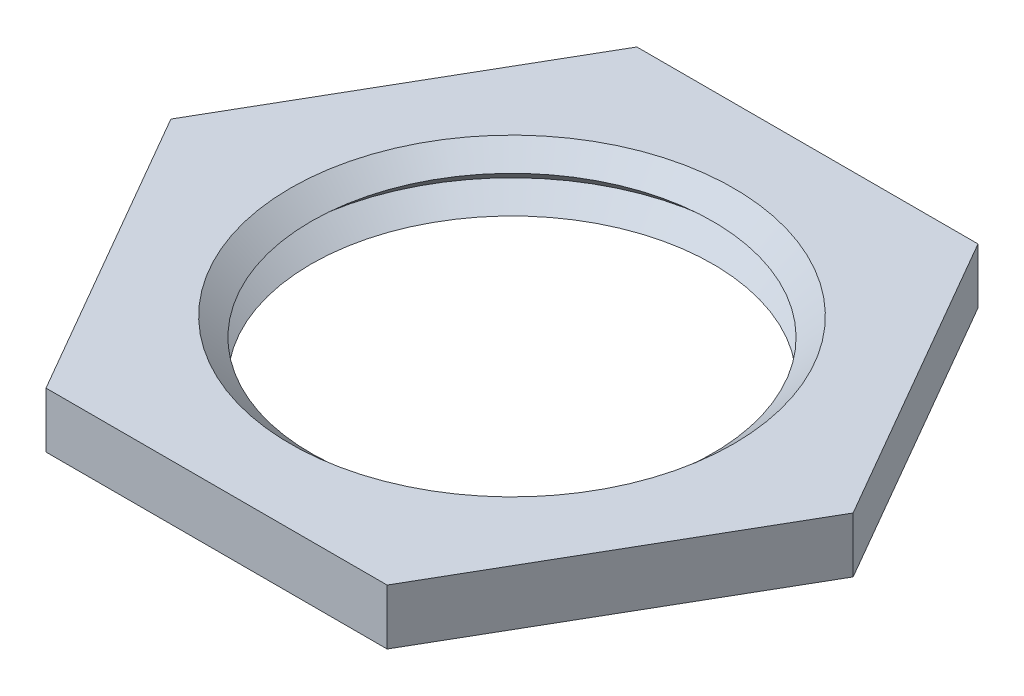
ISO-10303-21;
HEADER;
FILE_DESCRIPTION(('STEP AP214'),'2;1');
FILE_NAME('part.step','',(''),(''),'','','');
FILE_SCHEMA(('AUTOMOTIVE_DESIGN { 1 0 10303 214 1 1 1 1 }'));
ENDSEC;
DATA;
#1=APPLICATION_CONTEXT('core data for automotive mechanical design processes');
#2=APPLICATION_PROTOCOL_DEFINITION('international standard','automotive_design',2000,#1);
#3=PRODUCT_CONTEXT('',#1,'mechanical');
#4=PRODUCT('Part','Part','',(#3));
#5=PRODUCT_RELATED_PRODUCT_CATEGORY('part','',(#4));
#6=PRODUCT_DEFINITION_FORMATION('','',#4);
#7=PRODUCT_DEFINITION_CONTEXT('part definition',#1,'design');
#8=PRODUCT_DEFINITION('design','',#6,#7);
#9=PRODUCT_DEFINITION_SHAPE('','',#8);
#10=(LENGTH_UNIT() NAMED_UNIT(*) SI_UNIT(.MILLI.,.METRE.));
#11=(NAMED_UNIT(*) PLANE_ANGLE_UNIT() SI_UNIT($,.RADIAN.));
#12=(NAMED_UNIT(*) SI_UNIT($,.STERADIAN.) SOLID_ANGLE_UNIT());
#13=UNCERTAINTY_MEASURE_WITH_UNIT(LENGTH_MEASURE(1.E-05),#10,'distance_accuracy_value','');
#14=(GEOMETRIC_REPRESENTATION_CONTEXT(3) GLOBAL_UNCERTAINTY_ASSIGNED_CONTEXT((#13)) GLOBAL_UNIT_ASSIGNED_CONTEXT((#10,
#11,#12)) REPRESENTATION_CONTEXT('',''));
#15=CARTESIAN_POINT('',(0.,0.,0.));
#16=DIRECTION('',(0.,0.,1.));
#17=DIRECTION('',(1.,0.,0.));
#18=AXIS2_PLACEMENT_3D('',#15,#16,#17);
#19=CARTESIAN_POINT('',(0.,1.191006,0.));
#20=DIRECTION('',(0.,1.,0.));
#21=DIRECTION('',(0.,0.,1.));
#22=AXIS2_PLACEMENT_3D('',#19,#20,#21);
#23=PLANE('',#22);
#24=DIRECTION('',(0.5,0.,-0.866025403784439));
#25=VECTOR('',#24,1.);
#26=CARTESIAN_POINT('',(3.66617420935413,1.191006,6.35));
#27=LINE('',#26,#25);
#28=CARTESIAN_POINT('',(3.66617420935413,1.191006,6.35));
#29=VERTEX_POINT('',#28);
#30=CARTESIAN_POINT('',(7.33234841870824,1.191006,0.));
#31=VERTEX_POINT('',#30);
#32=EDGE_CURVE('E130',#29,#31,#27,.T.);
#33=ORIENTED_EDGE('',*,*,#32,.T.);
#34=DIRECTION('',(-0.500000000000001,0.,-0.866025403784438));
#35=VECTOR('',#34,1.);
#36=CARTESIAN_POINT('',(7.33234841870824,1.191006,0.));
#37=LINE('',#36,#35);
#38=CARTESIAN_POINT('',(3.66617420935411,1.191006,-6.35));
#39=VERTEX_POINT('',#38);
#40=EDGE_CURVE('E88',#31,#39,#37,.T.);
#41=ORIENTED_EDGE('',*,*,#40,.T.);
#42=DIRECTION('',(-1.,0.,0.));
#43=VECTOR('',#42,1.);
#44=CARTESIAN_POINT('',(3.66617420935411,1.191006,-6.35));
#45=LINE('',#44,#43);
#46=CARTESIAN_POINT('',(-3.66617420935412,1.191006,-6.35));
#47=VERTEX_POINT('',#46);
#48=EDGE_CURVE('E101',#39,#47,#45,.T.);
#49=ORIENTED_EDGE('',*,*,#48,.T.);
#50=DIRECTION('',(-0.5,0.,0.866025403784439));
#51=VECTOR('',#50,1.);
#52=CARTESIAN_POINT('',(-3.66617420935412,1.191006,-6.35));
#53=LINE('',#52,#51);
#54=CARTESIAN_POINT('',(-7.33234841870824,1.191006,0.));
#55=VERTEX_POINT('',#54);
#56=EDGE_CURVE('E95',#47,#55,#53,.T.);
#57=ORIENTED_EDGE('',*,*,#56,.T.);
#58=DIRECTION('',(0.5,0.,0.866025403784438));
#59=VECTOR('',#58,1.);
#60=CARTESIAN_POINT('',(-7.33234841870824,1.191006,0.));
#61=LINE('',#60,#59);
#62=CARTESIAN_POINT('',(-3.66617420935412,1.191006,6.35));
#63=VERTEX_POINT('',#62);
#64=EDGE_CURVE('E99',#55,#63,#61,.T.);
#65=ORIENTED_EDGE('',*,*,#64,.T.);
#66=DIRECTION('',(1.,0.,0.));
#67=VECTOR('',#66,1.);
#68=CARTESIAN_POINT('',(-3.66617420935412,1.191006,6.35));
#69=LINE('',#68,#67);
#70=EDGE_CURVE('E51',#63,#29,#69,.T.);
#71=ORIENTED_EDGE('',*,*,#70,.T.);
#72=EDGE_LOOP('',(#33,#41,#49,#57,#65,#71));
#73=FACE_BOUND('',#72,.T.);
#74=CARTESIAN_POINT('',(0.,1.19100600000003,0.));
#75=DIRECTION('',(0.,1.,0.));
#76=DIRECTION('',(-1.,0.,0.));
#77=AXIS2_PLACEMENT_3D('',#74,#75,#76);
#78=CIRCLE('',#77,4.76249999999999);
#79=CARTESIAN_POINT('',(-4.76249999999998,1.19100600000006,0.));
#80=VERTEX_POINT('',#79);
#81=EDGE_CURVE('E174',#80,#80,#78,.T.);
#82=ORIENTED_EDGE('',*,*,#81,.F.);
#83=EDGE_LOOP('',(#82));
#84=FACE_BOUND('',#83,.T.);
#85=ADVANCED_FACE('F34',(#73,#84),#23,.T.);
#86=CARTESIAN_POINT('',(0.,0.,0.));
#87=DIRECTION('',(0.,1.,0.));
#88=DIRECTION('',(0.,0.,1.));
#89=AXIS2_PLACEMENT_3D('',#86,#87,#88);
#90=PLANE('',#89);
#91=DIRECTION('',(0.5,0.,-0.866025403784439));
#92=VECTOR('',#91,1.);
#93=CARTESIAN_POINT('',(3.66617420935413,0.,6.35));
#94=LINE('',#93,#92);
#95=CARTESIAN_POINT('',(3.66617420935413,0.,6.35));
#96=VERTEX_POINT('',#95);
#97=CARTESIAN_POINT('',(7.33234841870824,0.,0.));
#98=VERTEX_POINT('',#97);
#99=EDGE_CURVE('E119',#96,#98,#94,.T.);
#100=ORIENTED_EDGE('',*,*,#99,.F.);
#101=DIRECTION('',(1.,0.,0.));
#102=VECTOR('',#101,1.);
#103=CARTESIAN_POINT('',(-3.66617420935412,0.,6.35));
#104=LINE('',#103,#102);
#105=CARTESIAN_POINT('',(-3.66617420935412,0.,6.35));
#106=VERTEX_POINT('',#105);
#107=EDGE_CURVE('E80',#106,#96,#104,.T.);
#108=ORIENTED_EDGE('',*,*,#107,.F.);
#109=DIRECTION('',(0.5,0.,0.866025403784438));
#110=VECTOR('',#109,1.);
#111=CARTESIAN_POINT('',(-7.33234841870824,0.,0.));
#112=LINE('',#111,#110);
#113=CARTESIAN_POINT('',(-7.33234841870824,0.,0.));
#114=VERTEX_POINT('',#113);
#115=EDGE_CURVE('E74',#114,#106,#112,.T.);
#116=ORIENTED_EDGE('',*,*,#115,.F.);
#117=DIRECTION('',(-0.5,0.,0.866025403784439));
#118=VECTOR('',#117,1.);
#119=CARTESIAN_POINT('',(-3.66617420935412,0.,-6.35));
#120=LINE('',#119,#118);
#121=CARTESIAN_POINT('',(-3.66617420935412,0.,-6.35));
#122=VERTEX_POINT('',#121);
#123=EDGE_CURVE('E109',#122,#114,#120,.T.);
#124=ORIENTED_EDGE('',*,*,#123,.F.);
#125=DIRECTION('',(-1.,0.,0.));
#126=VECTOR('',#125,1.);
#127=CARTESIAN_POINT('',(3.66617420935411,0.,-6.35));
#128=LINE('',#127,#126);
#129=CARTESIAN_POINT('',(3.66617420935411,0.,-6.35));
#130=VERTEX_POINT('',#129);
#131=EDGE_CURVE('E125',#130,#122,#128,.T.);
#132=ORIENTED_EDGE('',*,*,#131,.F.);
#133=DIRECTION('',(-0.500000000000001,0.,-0.866025403784438));
#134=VECTOR('',#133,1.);
#135=CARTESIAN_POINT('',(7.33234841870824,0.,0.));
#136=LINE('',#135,#134);
#137=EDGE_CURVE('E122',#98,#130,#136,.T.);
#138=ORIENTED_EDGE('',*,*,#137,.F.);
#139=EDGE_LOOP('',(#100,#108,#116,#124,#132,#138));
#140=FACE_BOUND('',#139,.T.);
#141=CARTESIAN_POINT('',(0.,0.,0.));
#142=DIRECTION('',(0.,1.,0.));
#143=DIRECTION('',(-1.,0.,0.));
#144=AXIS2_PLACEMENT_3D('',#141,#142,#143);
#145=CIRCLE('',#144,4.318);
#146=CARTESIAN_POINT('',(-4.318,0.,0.));
#147=VERTEX_POINT('',#146);
#148=EDGE_CURVE('E123',#147,#147,#145,.T.);
#149=ORIENTED_EDGE('',*,*,#148,.T.);
#150=EDGE_LOOP('',(#149));
#151=FACE_BOUND('',#150,.T.);
#152=ADVANCED_FACE('F139',(#140,#151),#90,.F.);
#153=CARTESIAN_POINT('',(3.66617420935413,1.191006,6.35));
#154=DIRECTION('',(-0.866025403784439,0.,-0.5));
#155=DIRECTION('',(-0.5,0.,0.866025403784439));
#156=AXIS2_PLACEMENT_3D('',#153,#154,#155);
#157=PLANE('',#156);
#158=ORIENTED_EDGE('',*,*,#99,.T.);
#159=DIRECTION('',(0.,-1.,0.));
#160=VECTOR('',#159,1.);
#161=CARTESIAN_POINT('',(7.33234841870824,1.191006,0.));
#162=LINE('',#161,#160);
#163=EDGE_CURVE('E11',#31,#98,#162,.T.);
#164=ORIENTED_EDGE('',*,*,#163,.F.);
#165=ORIENTED_EDGE('',*,*,#32,.F.);
#166=DIRECTION('',(0.,-1.,0.));
#167=VECTOR('',#166,1.);
#168=CARTESIAN_POINT('',(3.66617420935413,1.191006,6.35));
#169=LINE('',#168,#167);
#170=EDGE_CURVE('E115',#29,#96,#169,.T.);
#171=ORIENTED_EDGE('',*,*,#170,.T.);
#172=EDGE_LOOP('',(#158,#164,#165,#171));
#173=FACE_BOUND('',#172,.T.);
#174=ADVANCED_FACE('F36',(#173),#157,.F.);
#175=CARTESIAN_POINT('',(7.33234841870824,1.191006,0.));
#176=DIRECTION('',(-0.866025403784438,0.,0.500000000000001));
#177=DIRECTION('',(0.500000000000001,0.,0.866025403784438));
#178=AXIS2_PLACEMENT_3D('',#175,#176,#177);
#179=PLANE('',#178);
#180=ORIENTED_EDGE('',*,*,#137,.T.);
#181=DIRECTION('',(0.,-1.,0.));
#182=VECTOR('',#181,1.);
#183=CARTESIAN_POINT('',(3.66617420935411,1.191006,-6.35));
#184=LINE('',#183,#182);
#185=EDGE_CURVE('E43',#39,#130,#184,.T.);
#186=ORIENTED_EDGE('',*,*,#185,.F.);
#187=ORIENTED_EDGE('',*,*,#40,.F.);
#188=ORIENTED_EDGE('',*,*,#163,.T.);
#189=EDGE_LOOP('',(#180,#186,#187,#188));
#190=FACE_BOUND('',#189,.T.);
#191=ADVANCED_FACE('F230',(#190),#179,.F.);
#192=CARTESIAN_POINT('',(3.66617420935411,1.191006,-6.35));
#193=DIRECTION('',(0.,0.,1.));
#194=DIRECTION('',(1.,0.,0.));
#195=AXIS2_PLACEMENT_3D('',#192,#193,#194);
#196=PLANE('',#195);
#197=ORIENTED_EDGE('',*,*,#131,.T.);
#198=DIRECTION('',(0.,-1.,0.));
#199=VECTOR('',#198,1.);
#200=CARTESIAN_POINT('',(-3.66617420935412,1.191006,-6.35));
#201=LINE('',#200,#199);
#202=EDGE_CURVE('E110',#47,#122,#201,.T.);
#203=ORIENTED_EDGE('',*,*,#202,.F.);
#204=ORIENTED_EDGE('',*,*,#48,.F.);
#205=ORIENTED_EDGE('',*,*,#185,.T.);
#206=EDGE_LOOP('',(#197,#203,#204,#205));
#207=FACE_BOUND('',#206,.T.);
#208=ADVANCED_FACE('F136',(#207),#196,.F.);
#209=CARTESIAN_POINT('',(-3.66617420935412,1.191006,-6.35));
#210=DIRECTION('',(0.866025403784439,0.,0.5));
#211=DIRECTION('',(0.5,0.,-0.866025403784439));
#212=AXIS2_PLACEMENT_3D('',#209,#210,#211);
#213=PLANE('',#212);
#214=ORIENTED_EDGE('',*,*,#123,.T.);
#215=DIRECTION('',(0.,-1.,0.));
#216=VECTOR('',#215,1.);
#217=CARTESIAN_POINT('',(-7.33234841870824,1.191006,0.));
#218=LINE('',#217,#216);
#219=EDGE_CURVE('E106',#55,#114,#218,.T.);
#220=ORIENTED_EDGE('',*,*,#219,.F.);
#221=ORIENTED_EDGE('',*,*,#56,.F.);
#222=ORIENTED_EDGE('',*,*,#202,.T.);
#223=EDGE_LOOP('',(#214,#220,#221,#222));
#224=FACE_BOUND('',#223,.T.);
#225=ADVANCED_FACE('F107',(#224),#213,.F.);
#226=CARTESIAN_POINT('',(-7.33234841870824,1.191006,0.));
#227=DIRECTION('',(0.866025403784438,0.,-0.5));
#228=DIRECTION('',(-0.5,0.,-0.866025403784439));
#229=AXIS2_PLACEMENT_3D('',#226,#227,#228);
#230=PLANE('',#229);
#231=ORIENTED_EDGE('',*,*,#115,.T.);
#232=DIRECTION('',(0.,-1.,0.));
#233=VECTOR('',#232,1.);
#234=CARTESIAN_POINT('',(-3.66617420935412,1.191006,6.35));
#235=LINE('',#234,#233);
#236=EDGE_CURVE('E111',#63,#106,#235,.T.);
#237=ORIENTED_EDGE('',*,*,#236,.F.);
#238=ORIENTED_EDGE('',*,*,#64,.F.);
#239=ORIENTED_EDGE('',*,*,#219,.T.);
#240=EDGE_LOOP('',(#231,#237,#238,#239));
#241=FACE_BOUND('',#240,.T.);
#242=ADVANCED_FACE('F113',(#241),#230,.F.);
#243=CARTESIAN_POINT('',(-3.66617420935412,1.191006,6.35));
#244=DIRECTION('',(0.,0.,-1.));
#245=DIRECTION('',(-1.,0.,0.));
#246=AXIS2_PLACEMENT_3D('',#243,#244,#245);
#247=PLANE('',#246);
#248=ORIENTED_EDGE('',*,*,#107,.T.);
#249=ORIENTED_EDGE('',*,*,#170,.F.);
#250=ORIENTED_EDGE('',*,*,#70,.F.);
#251=ORIENTED_EDGE('',*,*,#236,.T.);
#252=EDGE_LOOP('',(#248,#249,#250,#251));
#253=FACE_BOUND('',#252,.T.);
#254=ADVANCED_FACE('F144',(#253),#247,.F.);
#255=CARTESIAN_POINT('',(0.,0.,0.));
#256=DIRECTION('',(0.,1.,0.));
#257=DIRECTION('',(-1.,0.,0.));
#258=AXIS2_PLACEMENT_3D('',#255,#256,#257);
#259=CONICAL_SURFACE('',#258,4.318,0.84178264490789);
#260=CARTESIAN_POINT('',(0.,0.397002000000031,0.));
#261=DIRECTION('',(0.,1.,0.));
#262=DIRECTION('',(-1.,0.,0.));
#263=AXIS2_PLACEMENT_3D('',#260,#261,#262);
#264=CIRCLE('',#263,4.7625);
#265=CARTESIAN_POINT('',(-4.76249999999999,0.397002000000062,0.));
#266=VERTEX_POINT('',#265);
#267=EDGE_CURVE('E178',#266,#266,#264,.T.);
#268=ORIENTED_EDGE('',*,*,#267,.T.);
#269=EDGE_LOOP('',(#268));
#270=FACE_BOUND('',#269,.T.);
#271=ORIENTED_EDGE('',*,*,#148,.F.);
#272=EDGE_LOOP('',(#271));
#273=FACE_BOUND('',#272,.T.);
#274=ADVANCED_FACE('F146',(#270,#273),#259,.F.);
#275=CARTESIAN_POINT('',(0.,0.397002000000031,0.));
#276=DIRECTION('',(0.,-1.,0.));
#277=DIRECTION('',(1.,0.,0.));
#278=AXIS2_PLACEMENT_3D('',#275,#276,#277);
#279=CONICAL_SURFACE('',#278,4.7625,0.841782644907903);
#280=CARTESIAN_POINT('',(0.,0.794004000000028,0.));
#281=DIRECTION('',(0.,1.,0.));
#282=DIRECTION('',(-1.,0.,0.));
#283=AXIS2_PLACEMENT_3D('',#280,#281,#282);
#284=CIRCLE('',#283,4.31799999999999);
#285=CARTESIAN_POINT('',(-4.31799999999999,0.794004000000057,0.));
#286=VERTEX_POINT('',#285);
#287=EDGE_CURVE('E177',#286,#286,#284,.T.);
#288=ORIENTED_EDGE('',*,*,#287,.T.);
#289=EDGE_LOOP('',(#288));
#290=FACE_BOUND('',#289,.T.);
#291=ORIENTED_EDGE('',*,*,#267,.F.);
#292=EDGE_LOOP('',(#291));
#293=FACE_BOUND('',#292,.T.);
#294=ADVANCED_FACE('F152',(#290,#293),#279,.F.);
#295=CARTESIAN_POINT('',(0.,0.794004000000028,0.));
#296=DIRECTION('',(0.,1.,0.));
#297=DIRECTION('',(-1.,0.,0.));
#298=AXIS2_PLACEMENT_3D('',#295,#296,#297);
#299=CONICAL_SURFACE('',#298,4.31799999999999,0.84178264490789);
#300=ORIENTED_EDGE('',*,*,#81,.T.);
#301=EDGE_LOOP('',(#300));
#302=FACE_BOUND('',#301,.T.);
#303=ORIENTED_EDGE('',*,*,#287,.F.);
#304=EDGE_LOOP('',(#303));
#305=FACE_BOUND('',#304,.T.);
#306=ADVANCED_FACE('F165',(#302,#305),#299,.F.);
#307=CLOSED_SHELL('',(#85,#152,#174,#191,#208,#225,#242,#254,#274,#294,#306));
#308=MANIFOLD_SOLID_BREP('B2',#307);
#309=ADVANCED_BREP_SHAPE_REPRESENTATION('',(#18,#308),#14);
#310=SHAPE_DEFINITION_REPRESENTATION(#9,#309);
ENDSEC;
END-ISO-10303-21;
